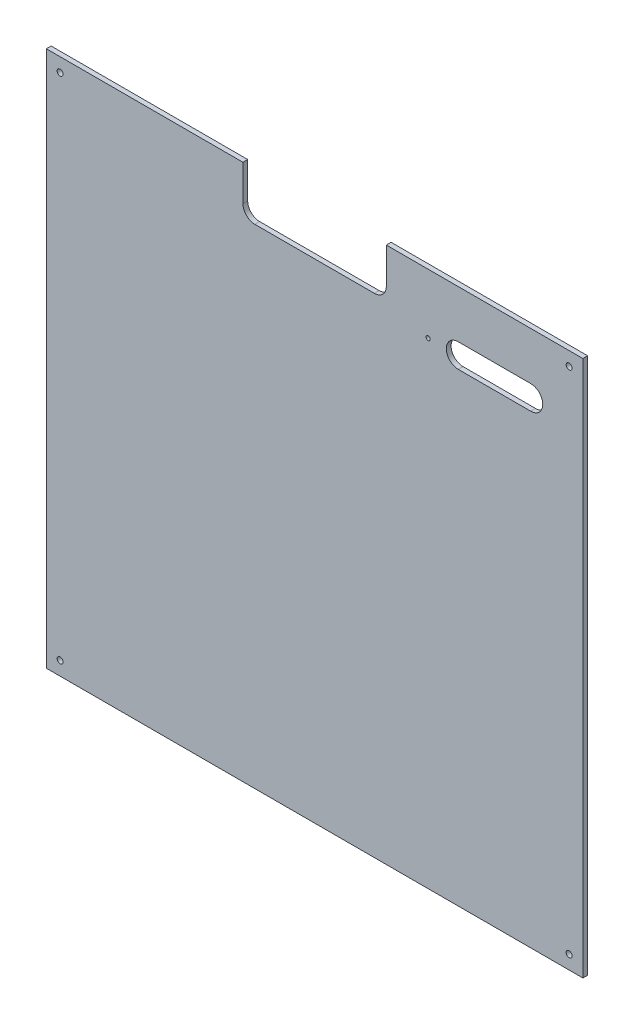
ISO-10303-21;
HEADER;
FILE_DESCRIPTION(('STEP AP214'),'2;1');
FILE_NAME('part.step','',(''),(''),'','','');
FILE_SCHEMA(('AUTOMOTIVE_DESIGN { 1 0 10303 214 1 1 1 1 }'));
ENDSEC;
DATA;
#1=APPLICATION_CONTEXT('core data for automotive mechanical design processes');
#2=APPLICATION_PROTOCOL_DEFINITION('international standard','automotive_design',2000,#1);
#3=PRODUCT_CONTEXT('',#1,'mechanical');
#4=PRODUCT('Part','Part','',(#3));
#5=PRODUCT_RELATED_PRODUCT_CATEGORY('part','',(#4));
#6=PRODUCT_DEFINITION_FORMATION('','',#4);
#7=PRODUCT_DEFINITION_CONTEXT('part definition',#1,'design');
#8=PRODUCT_DEFINITION('design','',#6,#7);
#9=PRODUCT_DEFINITION_SHAPE('','',#8);
#10=(LENGTH_UNIT() NAMED_UNIT(*) SI_UNIT(.MILLI.,.METRE.));
#11=(NAMED_UNIT(*) PLANE_ANGLE_UNIT() SI_UNIT($,.RADIAN.));
#12=(NAMED_UNIT(*) SI_UNIT($,.STERADIAN.) SOLID_ANGLE_UNIT());
#13=UNCERTAINTY_MEASURE_WITH_UNIT(LENGTH_MEASURE(1.E-05),#10,'distance_accuracy_value','');
#14=(GEOMETRIC_REPRESENTATION_CONTEXT(3) GLOBAL_UNCERTAINTY_ASSIGNED_CONTEXT((#13)) GLOBAL_UNIT_ASSIGNED_CONTEXT((#10,
#11,#12)) REPRESENTATION_CONTEXT('',''));
#15=CARTESIAN_POINT('',(0.,0.,0.));
#16=DIRECTION('',(0.,0.,1.));
#17=DIRECTION('',(1.,0.,0.));
#18=AXIS2_PLACEMENT_3D('',#15,#16,#17);
#19=CARTESIAN_POINT('',(174.5,419.,4.));
#20=DIRECTION('',(0.,0.,1.));
#21=DIRECTION('',(1.,0.,0.));
#22=AXIS2_PLACEMENT_3D('',#19,#20,#21);
#23=PLANE('',#22);
#24=DIRECTION('',(1.,0.,0.));
#25=VECTOR('',#24,1.);
#26=CARTESIAN_POINT('',(344.715899344631,389.,4.));
#27=LINE('',#26,#25);
#28=CARTESIAN_POINT('',(344.715899344631,389.,4.));
#29=VERTEX_POINT('',#28);
#30=CARTESIAN_POINT('',(405.440355678252,389.,4.));
#31=VERTEX_POINT('',#30);
#32=EDGE_CURVE('E148',#29,#31,#27,.T.);
#33=ORIENTED_EDGE('',*,*,#32,.F.);
#34=CARTESIAN_POINT('',(344.715899344631,399.,4.));
#35=DIRECTION('',(0.,0.,1.));
#36=DIRECTION('',(1.,0.,0.));
#37=AXIS2_PLACEMENT_3D('',#34,#35,#36);
#38=CIRCLE('',#37,10.);
#39=CARTESIAN_POINT('',(344.715899344631,409.,4.));
#40=VERTEX_POINT('',#39);
#41=EDGE_CURVE('E140',#40,#29,#38,.T.);
#42=ORIENTED_EDGE('',*,*,#41,.F.);
#43=DIRECTION('',(-1.,0.,0.));
#44=VECTOR('',#43,1.);
#45=CARTESIAN_POINT('',(344.715899344631,409.,4.));
#46=LINE('',#45,#44);
#47=CARTESIAN_POINT('',(405.440355678252,409.,4.));
#48=VERTEX_POINT('',#47);
#49=EDGE_CURVE('E163',#48,#40,#46,.T.);
#50=ORIENTED_EDGE('',*,*,#49,.F.);
#51=CARTESIAN_POINT('',(405.440355678252,399.,4.));
#52=DIRECTION('',(0.,0.,1.));
#53=DIRECTION('',(1.,0.,0.));
#54=AXIS2_PLACEMENT_3D('',#51,#52,#53);
#55=CIRCLE('',#54,10.);
#56=EDGE_CURVE('E161',#31,#48,#55,.T.);
#57=ORIENTED_EDGE('',*,*,#56,.F.);
#58=EDGE_LOOP('',(#33,#42,#50,#57));
#59=FACE_BOUND('',#58,.T.);
#60=CARTESIAN_POINT('',(11.5,437.5,4.));
#61=DIRECTION('',(0.,0.,1.));
#62=DIRECTION('',(-1.,0.,0.));
#63=AXIS2_PLACEMENT_3D('',#60,#61,#62);
#64=CIRCLE('',#63,2.5);
#65=CARTESIAN_POINT('',(9.,437.5,4.));
#66=VERTEX_POINT('',#65);
#67=EDGE_CURVE('E179',#66,#66,#64,.T.);
#68=ORIENTED_EDGE('',*,*,#67,.F.);
#69=EDGE_LOOP('',(#68));
#70=FACE_BOUND('',#69,.T.);
#71=CARTESIAN_POINT('',(437.5,11.5,4.));
#72=DIRECTION('',(0.,0.,1.));
#73=DIRECTION('',(-1.,0.,0.));
#74=AXIS2_PLACEMENT_3D('',#71,#72,#73);
#75=CIRCLE('',#74,2.49999999999997);
#76=CARTESIAN_POINT('',(435.,11.5,4.));
#77=VERTEX_POINT('',#76);
#78=EDGE_CURVE('E191',#77,#77,#75,.T.);
#79=ORIENTED_EDGE('',*,*,#78,.F.);
#80=EDGE_LOOP('',(#79));
#81=FACE_BOUND('',#80,.T.);
#82=DIRECTION('',(1.,0.,0.));
#83=VECTOR('',#82,1.);
#84=CARTESIAN_POINT('',(449.,0.,4.));
#85=LINE('',#84,#83);
#86=CARTESIAN_POINT('',(0.,0.,4.));
#87=VERTEX_POINT('',#86);
#88=CARTESIAN_POINT('',(449.,0.,4.));
#89=VERTEX_POINT('',#88);
#90=EDGE_CURVE('E203',#87,#89,#85,.T.);
#91=ORIENTED_EDGE('',*,*,#90,.T.);
#92=DIRECTION('',(0.,1.,0.));
#93=VECTOR('',#92,1.);
#94=CARTESIAN_POINT('',(449.,449.,4.));
#95=LINE('',#94,#93);
#96=CARTESIAN_POINT('',(449.,449.,4.));
#97=VERTEX_POINT('',#96);
#98=EDGE_CURVE('E206',#89,#97,#95,.T.);
#99=ORIENTED_EDGE('',*,*,#98,.T.);
#100=DIRECTION('',(-1.,0.,0.));
#101=VECTOR('',#100,1.);
#102=CARTESIAN_POINT('',(284.5,449.,4.));
#103=LINE('',#102,#101);
#104=CARTESIAN_POINT('',(284.5,449.,4.));
#105=VERTEX_POINT('',#104);
#106=EDGE_CURVE('E209',#97,#105,#103,.T.);
#107=ORIENTED_EDGE('',*,*,#106,.T.);
#108=DIRECTION('',(0.,-1.,0.));
#109=VECTOR('',#108,1.);
#110=CARTESIAN_POINT('',(284.5,419.,4.));
#111=LINE('',#110,#109);
#112=CARTESIAN_POINT('',(284.5,419.,4.));
#113=VERTEX_POINT('',#112);
#114=EDGE_CURVE('E211',#105,#113,#111,.T.);
#115=ORIENTED_EDGE('',*,*,#114,.T.);
#116=CARTESIAN_POINT('',(274.5,419.,4.));
#117=DIRECTION('',(0.,0.,-1.));
#118=DIRECTION('',(-1.,0.,0.));
#119=AXIS2_PLACEMENT_3D('',#116,#117,#118);
#120=CIRCLE('',#119,10.);
#121=CARTESIAN_POINT('',(274.5,409.,4.));
#122=VERTEX_POINT('',#121);
#123=EDGE_CURVE('E213',#113,#122,#120,.T.);
#124=ORIENTED_EDGE('',*,*,#123,.T.);
#125=DIRECTION('',(-1.,0.,0.));
#126=VECTOR('',#125,1.);
#127=CARTESIAN_POINT('',(174.5,409.,4.));
#128=LINE('',#127,#126);
#129=CARTESIAN_POINT('',(174.5,409.,4.));
#130=VERTEX_POINT('',#129);
#131=EDGE_CURVE('E215',#122,#130,#128,.T.);
#132=ORIENTED_EDGE('',*,*,#131,.T.);
#133=CARTESIAN_POINT('',(174.5,419.,4.));
#134=DIRECTION('',(0.,0.,-1.));
#135=DIRECTION('',(1.,0.,0.));
#136=AXIS2_PLACEMENT_3D('',#133,#134,#135);
#137=CIRCLE('',#136,10.);
#138=CARTESIAN_POINT('',(164.5,419.,4.));
#139=VERTEX_POINT('',#138);
#140=EDGE_CURVE('E217',#130,#139,#137,.T.);
#141=ORIENTED_EDGE('',*,*,#140,.T.);
#142=DIRECTION('',(0.,1.,0.));
#143=VECTOR('',#142,1.);
#144=CARTESIAN_POINT('',(164.5,449.,4.));
#145=LINE('',#144,#143);
#146=CARTESIAN_POINT('',(164.5,449.,4.));
#147=VERTEX_POINT('',#146);
#148=EDGE_CURVE('E219',#139,#147,#145,.T.);
#149=ORIENTED_EDGE('',*,*,#148,.T.);
#150=DIRECTION('',(-1.,0.,0.));
#151=VECTOR('',#150,1.);
#152=CARTESIAN_POINT('',(0.,449.,4.));
#153=LINE('',#152,#151);
#154=CARTESIAN_POINT('',(0.,449.,4.));
#155=VERTEX_POINT('',#154);
#156=EDGE_CURVE('E221',#147,#155,#153,.T.);
#157=ORIENTED_EDGE('',*,*,#156,.T.);
#158=DIRECTION('',(0.,-1.,0.));
#159=VECTOR('',#158,1.);
#160=CARTESIAN_POINT('',(0.,0.,4.));
#161=LINE('',#160,#159);
#162=EDGE_CURVE('E223',#155,#87,#161,.T.);
#163=ORIENTED_EDGE('',*,*,#162,.T.);
#164=EDGE_LOOP('',(#91,#99,#107,#115,#124,#132,#141,#149,#157,#163));
#165=FACE_BOUND('',#164,.T.);
#166=CARTESIAN_POINT('',(11.5,11.5,4.));
#167=DIRECTION('',(0.,0.,1.));
#168=DIRECTION('',(1.,0.,0.));
#169=AXIS2_PLACEMENT_3D('',#166,#167,#168);
#170=CIRCLE('',#169,2.5);
#171=CARTESIAN_POINT('',(14.,11.5,4.));
#172=VERTEX_POINT('',#171);
#173=EDGE_CURVE('E197',#172,#172,#170,.T.);
#174=ORIENTED_EDGE('',*,*,#173,.F.);
#175=EDGE_LOOP('',(#174));
#176=FACE_BOUND('',#175,.T.);
#177=CARTESIAN_POINT('',(437.5,437.5,4.));
#178=DIRECTION('',(0.,0.,1.));
#179=DIRECTION('',(1.,0.,0.));
#180=AXIS2_PLACEMENT_3D('',#177,#178,#179);
#181=CIRCLE('',#180,2.49999999999997);
#182=CARTESIAN_POINT('',(440.,437.5,4.));
#183=VERTEX_POINT('',#182);
#184=EDGE_CURVE('E185',#183,#183,#181,.T.);
#185=ORIENTED_EDGE('',*,*,#184,.F.);
#186=EDGE_LOOP('',(#185));
#187=FACE_BOUND('',#186,.T.);
#188=CARTESIAN_POINT('',(319.5,399.,4.));
#189=DIRECTION('',(0.,0.,1.));
#190=DIRECTION('',(1.,0.,0.));
#191=AXIS2_PLACEMENT_3D('',#188,#189,#190);
#192=CIRCLE('',#191,1.74999999999998);
#193=CARTESIAN_POINT('',(321.25,399.,4.));
#194=VERTEX_POINT('',#193);
#195=EDGE_CURVE('E169',#194,#194,#192,.T.);
#196=ORIENTED_EDGE('',*,*,#195,.F.);
#197=EDGE_LOOP('',(#196));
#198=FACE_BOUND('',#197,.T.);
#199=ADVANCED_FACE('F39',(#59,#70,#81,#165,#176,#187,#198),#23,.T.);
#200=CARTESIAN_POINT('',(174.5,419.,0.));
#201=DIRECTION('',(0.,0.,1.));
#202=DIRECTION('',(1.,0.,0.));
#203=AXIS2_PLACEMENT_3D('',#200,#201,#202);
#204=PLANE('',#203);
#205=CARTESIAN_POINT('',(11.5,437.5,0.));
#206=DIRECTION('',(0.,0.,1.));
#207=DIRECTION('',(-1.,0.,0.));
#208=AXIS2_PLACEMENT_3D('',#205,#206,#207);
#209=CIRCLE('',#208,2.5);
#210=CARTESIAN_POINT('',(9.,437.5,0.));
#211=VERTEX_POINT('',#210);
#212=EDGE_CURVE('E156',#211,#211,#209,.T.);
#213=ORIENTED_EDGE('',*,*,#212,.T.);
#214=EDGE_LOOP('',(#213));
#215=FACE_BOUND('',#214,.T.);
#216=CARTESIAN_POINT('',(437.5,437.5,0.));
#217=DIRECTION('',(0.,0.,1.));
#218=DIRECTION('',(1.,0.,0.));
#219=AXIS2_PLACEMENT_3D('',#216,#217,#218);
#220=CIRCLE('',#219,2.49999999999997);
#221=CARTESIAN_POINT('',(440.,437.5,0.));
#222=VERTEX_POINT('',#221);
#223=EDGE_CURVE('E182',#222,#222,#220,.T.);
#224=ORIENTED_EDGE('',*,*,#223,.T.);
#225=EDGE_LOOP('',(#224));
#226=FACE_BOUND('',#225,.T.);
#227=CARTESIAN_POINT('',(437.5,11.5,0.));
#228=DIRECTION('',(0.,0.,1.));
#229=DIRECTION('',(-1.,0.,0.));
#230=AXIS2_PLACEMENT_3D('',#227,#228,#229);
#231=CIRCLE('',#230,2.49999999999997);
#232=CARTESIAN_POINT('',(435.,11.5,0.));
#233=VERTEX_POINT('',#232);
#234=EDGE_CURVE('E188',#233,#233,#231,.T.);
#235=ORIENTED_EDGE('',*,*,#234,.T.);
#236=EDGE_LOOP('',(#235));
#237=FACE_BOUND('',#236,.T.);
#238=CARTESIAN_POINT('',(11.5,11.5,0.));
#239=DIRECTION('',(0.,0.,1.));
#240=DIRECTION('',(1.,0.,0.));
#241=AXIS2_PLACEMENT_3D('',#238,#239,#240);
#242=CIRCLE('',#241,2.5);
#243=CARTESIAN_POINT('',(14.,11.5,0.));
#244=VERTEX_POINT('',#243);
#245=EDGE_CURVE('E194',#244,#244,#242,.T.);
#246=ORIENTED_EDGE('',*,*,#245,.T.);
#247=EDGE_LOOP('',(#246));
#248=FACE_BOUND('',#247,.T.);
#249=DIRECTION('',(1.,0.,0.));
#250=VECTOR('',#249,1.);
#251=CARTESIAN_POINT('',(449.,0.,0.));
#252=LINE('',#251,#250);
#253=CARTESIAN_POINT('',(0.,0.,0.));
#254=VERTEX_POINT('',#253);
#255=CARTESIAN_POINT('',(449.,0.,0.));
#256=VERTEX_POINT('',#255);
#257=EDGE_CURVE('E200',#254,#256,#252,.T.);
#258=ORIENTED_EDGE('',*,*,#257,.F.);
#259=DIRECTION('',(0.,-1.,0.));
#260=VECTOR('',#259,1.);
#261=CARTESIAN_POINT('',(0.,0.,0.));
#262=LINE('',#261,#260);
#263=CARTESIAN_POINT('',(0.,449.,0.));
#264=VERTEX_POINT('',#263);
#265=EDGE_CURVE('E207',#264,#254,#262,.T.);
#266=ORIENTED_EDGE('',*,*,#265,.F.);
#267=DIRECTION('',(-1.,0.,0.));
#268=VECTOR('',#267,1.);
#269=CARTESIAN_POINT('',(0.,449.,0.));
#270=LINE('',#269,#268);
#271=CARTESIAN_POINT('',(164.5,449.,0.));
#272=VERTEX_POINT('',#271);
#273=EDGE_CURVE('E242',#272,#264,#270,.T.);
#274=ORIENTED_EDGE('',*,*,#273,.F.);
#275=DIRECTION('',(0.,1.,0.));
#276=VECTOR('',#275,1.);
#277=CARTESIAN_POINT('',(164.5,449.,0.));
#278=LINE('',#277,#276);
#279=CARTESIAN_POINT('',(164.5,419.,0.));
#280=VERTEX_POINT('',#279);
#281=EDGE_CURVE('E240',#280,#272,#278,.T.);
#282=ORIENTED_EDGE('',*,*,#281,.F.);
#283=CARTESIAN_POINT('',(174.5,419.,0.));
#284=DIRECTION('',(0.,0.,-1.));
#285=DIRECTION('',(1.,0.,0.));
#286=AXIS2_PLACEMENT_3D('',#283,#284,#285);
#287=CIRCLE('',#286,10.);
#288=CARTESIAN_POINT('',(174.5,409.,0.));
#289=VERTEX_POINT('',#288);
#290=EDGE_CURVE('E238',#289,#280,#287,.T.);
#291=ORIENTED_EDGE('',*,*,#290,.F.);
#292=DIRECTION('',(-1.,0.,0.));
#293=VECTOR('',#292,1.);
#294=CARTESIAN_POINT('',(174.5,409.,0.));
#295=LINE('',#294,#293);
#296=CARTESIAN_POINT('',(274.5,409.,0.));
#297=VERTEX_POINT('',#296);
#298=EDGE_CURVE('E236',#297,#289,#295,.T.);
#299=ORIENTED_EDGE('',*,*,#298,.F.);
#300=CARTESIAN_POINT('',(274.5,419.,0.));
#301=DIRECTION('',(0.,0.,-1.));
#302=DIRECTION('',(-1.,0.,0.));
#303=AXIS2_PLACEMENT_3D('',#300,#301,#302);
#304=CIRCLE('',#303,10.);
#305=CARTESIAN_POINT('',(284.5,419.,0.));
#306=VERTEX_POINT('',#305);
#307=EDGE_CURVE('E234',#306,#297,#304,.T.);
#308=ORIENTED_EDGE('',*,*,#307,.F.);
#309=DIRECTION('',(0.,-1.,0.));
#310=VECTOR('',#309,1.);
#311=CARTESIAN_POINT('',(284.5,419.,0.));
#312=LINE('',#311,#310);
#313=CARTESIAN_POINT('',(284.5,449.,0.));
#314=VERTEX_POINT('',#313);
#315=EDGE_CURVE('E232',#314,#306,#312,.T.);
#316=ORIENTED_EDGE('',*,*,#315,.F.);
#317=DIRECTION('',(-1.,0.,0.));
#318=VECTOR('',#317,1.);
#319=CARTESIAN_POINT('',(284.5,449.,0.));
#320=LINE('',#319,#318);
#321=CARTESIAN_POINT('',(449.,449.,0.));
#322=VERTEX_POINT('',#321);
#323=EDGE_CURVE('E230',#322,#314,#320,.T.);
#324=ORIENTED_EDGE('',*,*,#323,.F.);
#325=DIRECTION('',(0.,1.,0.));
#326=VECTOR('',#325,1.);
#327=CARTESIAN_POINT('',(449.,449.,0.));
#328=LINE('',#327,#326);
#329=EDGE_CURVE('E228',#256,#322,#328,.T.);
#330=ORIENTED_EDGE('',*,*,#329,.F.);
#331=EDGE_LOOP('',(#258,#266,#274,#282,#291,#299,#308,#316,#324,#330));
#332=FACE_BOUND('',#331,.T.);
#333=CARTESIAN_POINT('',(344.715899344631,399.,0.));
#334=DIRECTION('',(0.,0.,1.));
#335=DIRECTION('',(1.,0.,0.));
#336=AXIS2_PLACEMENT_3D('',#333,#334,#335);
#337=CIRCLE('',#336,10.);
#338=CARTESIAN_POINT('',(344.715899344631,409.,0.));
#339=VERTEX_POINT('',#338);
#340=CARTESIAN_POINT('',(344.715899344631,389.,0.));
#341=VERTEX_POINT('',#340);
#342=EDGE_CURVE('E62',#339,#341,#337,.T.);
#343=ORIENTED_EDGE('',*,*,#342,.T.);
#344=DIRECTION('',(1.,0.,0.));
#345=VECTOR('',#344,1.);
#346=CARTESIAN_POINT('',(344.715899344631,389.,0.));
#347=LINE('',#346,#345);
#348=CARTESIAN_POINT('',(405.440355678252,389.,0.));
#349=VERTEX_POINT('',#348);
#350=EDGE_CURVE('E155',#341,#349,#347,.T.);
#351=ORIENTED_EDGE('',*,*,#350,.T.);
#352=CARTESIAN_POINT('',(405.440355678252,399.,0.));
#353=DIRECTION('',(0.,0.,1.));
#354=DIRECTION('',(1.,0.,0.));
#355=AXIS2_PLACEMENT_3D('',#352,#353,#354);
#356=CIRCLE('',#355,10.);
#357=CARTESIAN_POINT('',(405.440355678252,409.,0.));
#358=VERTEX_POINT('',#357);
#359=EDGE_CURVE('E171',#349,#358,#356,.T.);
#360=ORIENTED_EDGE('',*,*,#359,.T.);
#361=DIRECTION('',(-1.,0.,0.));
#362=VECTOR('',#361,1.);
#363=CARTESIAN_POINT('',(344.715899344631,409.,0.));
#364=LINE('',#363,#362);
#365=EDGE_CURVE('E149',#358,#339,#364,.T.);
#366=ORIENTED_EDGE('',*,*,#365,.T.);
#367=EDGE_LOOP('',(#343,#351,#360,#366));
#368=FACE_BOUND('',#367,.T.);
#369=CARTESIAN_POINT('',(319.5,399.,0.));
#370=DIRECTION('',(0.,0.,1.));
#371=DIRECTION('',(1.,0.,0.));
#372=AXIS2_PLACEMENT_3D('',#369,#370,#371);
#373=CIRCLE('',#372,1.74999999999998);
#374=CARTESIAN_POINT('',(321.25,399.,0.));
#375=VERTEX_POINT('',#374);
#376=EDGE_CURVE('E507',#375,#375,#373,.T.);
#377=ORIENTED_EDGE('',*,*,#376,.T.);
#378=EDGE_LOOP('',(#377));
#379=FACE_BOUND('',#378,.T.);
#380=ADVANCED_FACE('F278',(#215,#226,#237,#248,#332,#368,#379),#204,.F.);
#381=CARTESIAN_POINT('',(449.,0.,4.));
#382=DIRECTION('',(0.,1.,0.));
#383=DIRECTION('',(0.,0.,1.));
#384=AXIS2_PLACEMENT_3D('',#381,#382,#383);
#385=PLANE('',#384);
#386=ORIENTED_EDGE('',*,*,#257,.T.);
#387=DIRECTION('',(0.,0.,-1.));
#388=VECTOR('',#387,1.);
#389=CARTESIAN_POINT('',(449.,0.,4.));
#390=LINE('',#389,#388);
#391=EDGE_CURVE('E11',#89,#256,#390,.T.);
#392=ORIENTED_EDGE('',*,*,#391,.F.);
#393=ORIENTED_EDGE('',*,*,#90,.F.);
#394=DIRECTION('',(0.,0.,-1.));
#395=VECTOR('',#394,1.);
#396=CARTESIAN_POINT('',(0.,0.,4.));
#397=LINE('',#396,#395);
#398=EDGE_CURVE('E225',#87,#254,#397,.T.);
#399=ORIENTED_EDGE('',*,*,#398,.T.);
#400=EDGE_LOOP('',(#386,#392,#393,#399));
#401=FACE_BOUND('',#400,.T.);
#402=ADVANCED_FACE('F41',(#401),#385,.F.);
#403=CARTESIAN_POINT('',(449.,449.,4.));
#404=DIRECTION('',(-1.,0.,0.));
#405=DIRECTION('',(0.,-1.,0.));
#406=AXIS2_PLACEMENT_3D('',#403,#404,#405);
#407=PLANE('',#406);
#408=ORIENTED_EDGE('',*,*,#329,.T.);
#409=DIRECTION('',(0.,0.,-1.));
#410=VECTOR('',#409,1.);
#411=CARTESIAN_POINT('',(449.,449.,4.));
#412=LINE('',#411,#410);
#413=EDGE_CURVE('E47',#97,#322,#412,.T.);
#414=ORIENTED_EDGE('',*,*,#413,.F.);
#415=ORIENTED_EDGE('',*,*,#98,.F.);
#416=ORIENTED_EDGE('',*,*,#391,.T.);
#417=EDGE_LOOP('',(#408,#414,#415,#416));
#418=FACE_BOUND('',#417,.T.);
#419=ADVANCED_FACE('F296',(#418),#407,.F.);
#420=CARTESIAN_POINT('',(284.5,449.,4.));
#421=DIRECTION('',(0.,-1.,0.));
#422=DIRECTION('',(0.,0.,-1.));
#423=AXIS2_PLACEMENT_3D('',#420,#421,#422);
#424=PLANE('',#423);
#425=ORIENTED_EDGE('',*,*,#323,.T.);
#426=DIRECTION('',(0.,0.,-1.));
#427=VECTOR('',#426,1.);
#428=CARTESIAN_POINT('',(284.5,449.,4.));
#429=LINE('',#428,#427);
#430=EDGE_CURVE('E265',#105,#314,#429,.T.);
#431=ORIENTED_EDGE('',*,*,#430,.F.);
#432=ORIENTED_EDGE('',*,*,#106,.F.);
#433=ORIENTED_EDGE('',*,*,#413,.T.);
#434=EDGE_LOOP('',(#425,#431,#432,#433));
#435=FACE_BOUND('',#434,.T.);
#436=ADVANCED_FACE('F272',(#435),#424,.F.);
#437=CARTESIAN_POINT('',(284.5,419.,4.));
#438=DIRECTION('',(1.,0.,0.));
#439=DIRECTION('',(0.,0.,-1.));
#440=AXIS2_PLACEMENT_3D('',#437,#438,#439);
#441=PLANE('',#440);
#442=ORIENTED_EDGE('',*,*,#315,.T.);
#443=DIRECTION('',(0.,0.,-1.));
#444=VECTOR('',#443,1.);
#445=CARTESIAN_POINT('',(284.5,419.,4.));
#446=LINE('',#445,#444);
#447=EDGE_CURVE('E262',#113,#306,#446,.T.);
#448=ORIENTED_EDGE('',*,*,#447,.F.);
#449=ORIENTED_EDGE('',*,*,#114,.F.);
#450=ORIENTED_EDGE('',*,*,#430,.T.);
#451=EDGE_LOOP('',(#442,#448,#449,#450));
#452=FACE_BOUND('',#451,.T.);
#453=ADVANCED_FACE('F284',(#452),#441,.F.);
#454=CARTESIAN_POINT('',(274.5,419.,4.));
#455=DIRECTION('',(0.,0.,-1.));
#456=DIRECTION('',(-1.,0.,0.));
#457=AXIS2_PLACEMENT_3D('',#454,#455,#456);
#458=CYLINDRICAL_SURFACE('',#457,10.);
#459=ORIENTED_EDGE('',*,*,#307,.T.);
#460=DIRECTION('',(0.,0.,-1.));
#461=VECTOR('',#460,1.);
#462=CARTESIAN_POINT('',(274.5,409.,4.));
#463=LINE('',#462,#461);
#464=EDGE_CURVE('E259',#122,#297,#463,.T.);
#465=ORIENTED_EDGE('',*,*,#464,.F.);
#466=ORIENTED_EDGE('',*,*,#123,.F.);
#467=ORIENTED_EDGE('',*,*,#447,.T.);
#468=EDGE_LOOP('',(#459,#465,#466,#467));
#469=FACE_BOUND('',#468,.T.);
#470=ADVANCED_FACE('F288',(#469),#458,.F.);
#471=CARTESIAN_POINT('',(174.5,409.,4.));
#472=DIRECTION('',(0.,-1.,0.));
#473=DIRECTION('',(0.,0.,-1.));
#474=AXIS2_PLACEMENT_3D('',#471,#472,#473);
#475=PLANE('',#474);
#476=ORIENTED_EDGE('',*,*,#298,.T.);
#477=DIRECTION('',(0.,0.,-1.));
#478=VECTOR('',#477,1.);
#479=CARTESIAN_POINT('',(174.5,409.,4.));
#480=LINE('',#479,#478);
#481=EDGE_CURVE('E256',#130,#289,#480,.T.);
#482=ORIENTED_EDGE('',*,*,#481,.F.);
#483=ORIENTED_EDGE('',*,*,#131,.F.);
#484=ORIENTED_EDGE('',*,*,#464,.T.);
#485=EDGE_LOOP('',(#476,#482,#483,#484));
#486=FACE_BOUND('',#485,.T.);
#487=ADVANCED_FACE('F319',(#486),#475,.F.);
#488=CARTESIAN_POINT('',(174.5,419.,4.));
#489=DIRECTION('',(0.,0.,-1.));
#490=DIRECTION('',(-1.,0.,0.));
#491=AXIS2_PLACEMENT_3D('',#488,#489,#490);
#492=CYLINDRICAL_SURFACE('',#491,10.);
#493=ORIENTED_EDGE('',*,*,#290,.T.);
#494=DIRECTION('',(0.,0.,-1.));
#495=VECTOR('',#494,1.);
#496=CARTESIAN_POINT('',(164.5,419.,4.));
#497=LINE('',#496,#495);
#498=EDGE_CURVE('E253',#139,#280,#497,.T.);
#499=ORIENTED_EDGE('',*,*,#498,.F.);
#500=ORIENTED_EDGE('',*,*,#140,.F.);
#501=ORIENTED_EDGE('',*,*,#481,.T.);
#502=EDGE_LOOP('',(#493,#499,#500,#501));
#503=FACE_BOUND('',#502,.T.);
#504=ADVANCED_FACE('F316',(#503),#492,.F.);
#505=CARTESIAN_POINT('',(164.5,449.,4.));
#506=DIRECTION('',(-1.,0.,0.));
#507=DIRECTION('',(0.,0.,1.));
#508=AXIS2_PLACEMENT_3D('',#505,#506,#507);
#509=PLANE('',#508);
#510=ORIENTED_EDGE('',*,*,#281,.T.);
#511=DIRECTION('',(0.,0.,-1.));
#512=VECTOR('',#511,1.);
#513=CARTESIAN_POINT('',(164.5,449.,4.));
#514=LINE('',#513,#512);
#515=EDGE_CURVE('E250',#147,#272,#514,.T.);
#516=ORIENTED_EDGE('',*,*,#515,.F.);
#517=ORIENTED_EDGE('',*,*,#148,.F.);
#518=ORIENTED_EDGE('',*,*,#498,.T.);
#519=EDGE_LOOP('',(#510,#516,#517,#518));
#520=FACE_BOUND('',#519,.T.);
#521=ADVANCED_FACE('F312',(#520),#509,.F.);
#522=CARTESIAN_POINT('',(0.,449.,4.));
#523=DIRECTION('',(0.,-1.,0.));
#524=DIRECTION('',(0.,0.,-1.));
#525=AXIS2_PLACEMENT_3D('',#522,#523,#524);
#526=PLANE('',#525);
#527=ORIENTED_EDGE('',*,*,#273,.T.);
#528=DIRECTION('',(0.,0.,-1.));
#529=VECTOR('',#528,1.);
#530=CARTESIAN_POINT('',(0.,449.,4.));
#531=LINE('',#530,#529);
#532=EDGE_CURVE('E247',#155,#264,#531,.T.);
#533=ORIENTED_EDGE('',*,*,#532,.F.);
#534=ORIENTED_EDGE('',*,*,#156,.F.);
#535=ORIENTED_EDGE('',*,*,#515,.T.);
#536=EDGE_LOOP('',(#527,#533,#534,#535));
#537=FACE_BOUND('',#536,.T.);
#538=ADVANCED_FACE('F308',(#537),#526,.F.);
#539=CARTESIAN_POINT('',(0.,0.,4.));
#540=DIRECTION('',(1.,0.,0.));
#541=DIRECTION('',(0.,0.,-1.));
#542=AXIS2_PLACEMENT_3D('',#539,#540,#541);
#543=PLANE('',#542);
#544=ORIENTED_EDGE('',*,*,#265,.T.);
#545=ORIENTED_EDGE('',*,*,#398,.F.);
#546=ORIENTED_EDGE('',*,*,#162,.F.);
#547=ORIENTED_EDGE('',*,*,#532,.T.);
#548=EDGE_LOOP('',(#544,#545,#546,#547));
#549=FACE_BOUND('',#548,.T.);
#550=ADVANCED_FACE('F303',(#549),#543,.F.);
#551=CARTESIAN_POINT('',(11.5,11.5,4.));
#552=DIRECTION('',(0.,0.,-1.));
#553=DIRECTION('',(-1.,0.,0.));
#554=AXIS2_PLACEMENT_3D('',#551,#552,#553);
#555=CYLINDRICAL_SURFACE('',#554,2.5);
#556=ORIENTED_EDGE('',*,*,#173,.T.);
#557=EDGE_LOOP('',(#556));
#558=FACE_BOUND('',#557,.T.);
#559=ORIENTED_EDGE('',*,*,#245,.F.);
#560=EDGE_LOOP('',(#559));
#561=FACE_BOUND('',#560,.T.);
#562=ADVANCED_FACE('F336',(#558,#561),#555,.F.);
#563=CARTESIAN_POINT('',(437.5,11.5,4.));
#564=DIRECTION('',(0.,0.,-1.));
#565=DIRECTION('',(-1.,0.,0.));
#566=AXIS2_PLACEMENT_3D('',#563,#564,#565);
#567=CYLINDRICAL_SURFACE('',#566,2.49999999999997);
#568=ORIENTED_EDGE('',*,*,#78,.T.);
#569=EDGE_LOOP('',(#568));
#570=FACE_BOUND('',#569,.T.);
#571=ORIENTED_EDGE('',*,*,#234,.F.);
#572=EDGE_LOOP('',(#571));
#573=FACE_BOUND('',#572,.T.);
#574=ADVANCED_FACE('F362',(#570,#573),#567,.F.);
#575=CARTESIAN_POINT('',(437.5,437.5,4.));
#576=DIRECTION('',(0.,0.,-1.));
#577=DIRECTION('',(-1.,0.,0.));
#578=AXIS2_PLACEMENT_3D('',#575,#576,#577);
#579=CYLINDRICAL_SURFACE('',#578,2.49999999999997);
#580=ORIENTED_EDGE('',*,*,#184,.T.);
#581=EDGE_LOOP('',(#580));
#582=FACE_BOUND('',#581,.T.);
#583=ORIENTED_EDGE('',*,*,#223,.F.);
#584=EDGE_LOOP('',(#583));
#585=FACE_BOUND('',#584,.T.);
#586=ADVANCED_FACE('F369',(#582,#585),#579,.F.);
#587=CARTESIAN_POINT('',(11.5,437.5,4.));
#588=DIRECTION('',(0.,0.,-1.));
#589=DIRECTION('',(-1.,0.,0.));
#590=AXIS2_PLACEMENT_3D('',#587,#588,#589);
#591=CYLINDRICAL_SURFACE('',#590,2.5);
#592=ORIENTED_EDGE('',*,*,#67,.T.);
#593=EDGE_LOOP('',(#592));
#594=FACE_BOUND('',#593,.T.);
#595=ORIENTED_EDGE('',*,*,#212,.F.);
#596=EDGE_LOOP('',(#595));
#597=FACE_BOUND('',#596,.T.);
#598=ADVANCED_FACE('F376',(#594,#597),#591,.F.);
#599=CARTESIAN_POINT('',(344.715899344631,399.,4.));
#600=DIRECTION('',(0.,0.,-1.));
#601=DIRECTION('',(-1.,0.,0.));
#602=AXIS2_PLACEMENT_3D('',#599,#600,#601);
#603=CYLINDRICAL_SURFACE('',#602,10.);
#604=ORIENTED_EDGE('',*,*,#342,.F.);
#605=DIRECTION('',(0.,0.,-1.));
#606=VECTOR('',#605,1.);
#607=CARTESIAN_POINT('',(344.715899344631,409.,4.));
#608=LINE('',#607,#606);
#609=EDGE_CURVE('E144',#40,#339,#608,.T.);
#610=ORIENTED_EDGE('',*,*,#609,.F.);
#611=ORIENTED_EDGE('',*,*,#41,.T.);
#612=DIRECTION('',(0.,0.,-1.));
#613=VECTOR('',#612,1.);
#614=CARTESIAN_POINT('',(344.715899344631,389.,4.));
#615=LINE('',#614,#613);
#616=EDGE_CURVE('E143',#29,#341,#615,.T.);
#617=ORIENTED_EDGE('',*,*,#616,.T.);
#618=EDGE_LOOP('',(#604,#610,#611,#617));
#619=FACE_BOUND('',#618,.T.);
#620=ADVANCED_FACE('F142',(#619),#603,.F.);
#621=CARTESIAN_POINT('',(344.715899344631,389.,4.));
#622=DIRECTION('',(0.,1.,0.));
#623=DIRECTION('',(0.,0.,1.));
#624=AXIS2_PLACEMENT_3D('',#621,#622,#623);
#625=PLANE('',#624);
#626=ORIENTED_EDGE('',*,*,#350,.F.);
#627=ORIENTED_EDGE('',*,*,#616,.F.);
#628=ORIENTED_EDGE('',*,*,#32,.T.);
#629=DIRECTION('',(0.,0.,-1.));
#630=VECTOR('',#629,1.);
#631=CARTESIAN_POINT('',(405.440355678252,389.,4.));
#632=LINE('',#631,#630);
#633=EDGE_CURVE('E157',#31,#349,#632,.T.);
#634=ORIENTED_EDGE('',*,*,#633,.T.);
#635=EDGE_LOOP('',(#626,#627,#628,#634));
#636=FACE_BOUND('',#635,.T.);
#637=ADVANCED_FACE('F152',(#636),#625,.T.);
#638=CARTESIAN_POINT('',(405.440355678252,399.,4.));
#639=DIRECTION('',(0.,0.,-1.));
#640=DIRECTION('',(-1.,0.,0.));
#641=AXIS2_PLACEMENT_3D('',#638,#639,#640);
#642=CYLINDRICAL_SURFACE('',#641,10.);
#643=ORIENTED_EDGE('',*,*,#359,.F.);
#644=ORIENTED_EDGE('',*,*,#633,.F.);
#645=ORIENTED_EDGE('',*,*,#56,.T.);
#646=DIRECTION('',(0.,0.,-1.));
#647=VECTOR('',#646,1.);
#648=CARTESIAN_POINT('',(405.440355678252,409.,4.));
#649=LINE('',#648,#647);
#650=EDGE_CURVE('E54',#48,#358,#649,.T.);
#651=ORIENTED_EDGE('',*,*,#650,.T.);
#652=EDGE_LOOP('',(#643,#644,#645,#651));
#653=FACE_BOUND('',#652,.T.);
#654=ADVANCED_FACE('F397',(#653),#642,.F.);
#655=CARTESIAN_POINT('',(344.715899344631,409.,4.));
#656=DIRECTION('',(0.,-1.,0.));
#657=DIRECTION('',(0.,0.,-1.));
#658=AXIS2_PLACEMENT_3D('',#655,#656,#657);
#659=PLANE('',#658);
#660=ORIENTED_EDGE('',*,*,#365,.F.);
#661=ORIENTED_EDGE('',*,*,#650,.F.);
#662=ORIENTED_EDGE('',*,*,#49,.T.);
#663=ORIENTED_EDGE('',*,*,#609,.T.);
#664=EDGE_LOOP('',(#660,#661,#662,#663));
#665=FACE_BOUND('',#664,.T.);
#666=ADVANCED_FACE('F404',(#665),#659,.T.);
#667=CARTESIAN_POINT('',(319.5,399.,4.));
#668=DIRECTION('',(0.,0.,-1.));
#669=DIRECTION('',(-1.,0.,0.));
#670=AXIS2_PLACEMENT_3D('',#667,#668,#669);
#671=CYLINDRICAL_SURFACE('',#670,1.74999999999998);
#672=ORIENTED_EDGE('',*,*,#195,.T.);
#673=EDGE_LOOP('',(#672));
#674=FACE_BOUND('',#673,.T.);
#675=ORIENTED_EDGE('',*,*,#376,.F.);
#676=EDGE_LOOP('',(#675));
#677=FACE_BOUND('',#676,.T.);
#678=ADVANCED_FACE('F412',(#674,#677),#671,.F.);
#679=CLOSED_SHELL('',(#199,#380,#402,#419,#436,#453,#470,#487,#504,#521,#538,#550,#562,#574,
#586,#598,#620,#637,#654,#666,#678));
#680=MANIFOLD_SOLID_BREP('B2',#679);
#681=ADVANCED_BREP_SHAPE_REPRESENTATION('',(#18,#680),#14);
#682=SHAPE_DEFINITION_REPRESENTATION(#9,#681);
ENDSEC;
END-ISO-10303-21;
